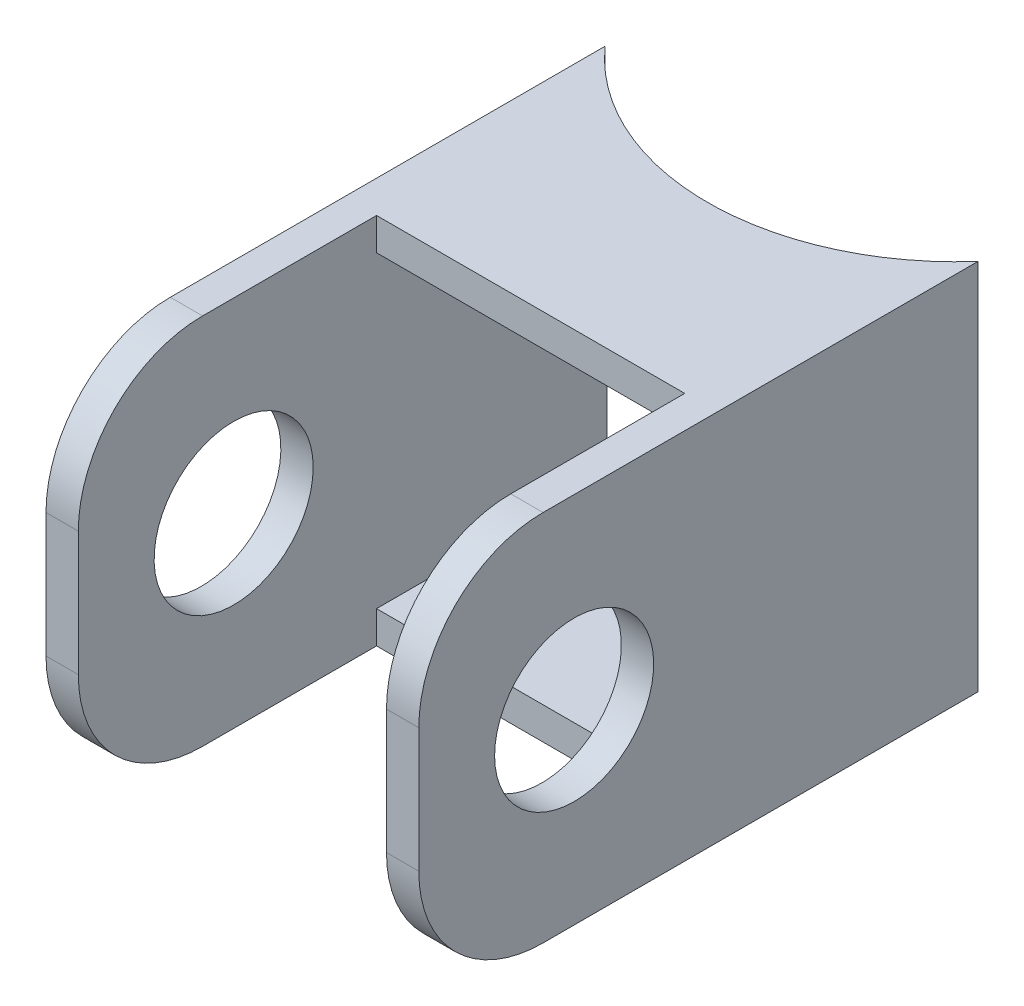
ISO-10303-21;
HEADER;
FILE_DESCRIPTION(('STEP AP214'),'2;1');
FILE_NAME('part.step','',(''),(''),'','','');
FILE_SCHEMA(('AUTOMOTIVE_DESIGN { 1 0 10303 214 1 1 1 1 }'));
ENDSEC;
DATA;
#1=APPLICATION_CONTEXT('core data for automotive mechanical design processes');
#2=APPLICATION_PROTOCOL_DEFINITION('international standard','automotive_design',2000,#1);
#3=PRODUCT_CONTEXT('',#1,'mechanical');
#4=PRODUCT('Part','Part','',(#3));
#5=PRODUCT_RELATED_PRODUCT_CATEGORY('part','',(#4));
#6=PRODUCT_DEFINITION_FORMATION('','',#4);
#7=PRODUCT_DEFINITION_CONTEXT('part definition',#1,'design');
#8=PRODUCT_DEFINITION('design','',#6,#7);
#9=PRODUCT_DEFINITION_SHAPE('','',#8);
#10=(LENGTH_UNIT() NAMED_UNIT(*) SI_UNIT(.MILLI.,.METRE.));
#11=(NAMED_UNIT(*) PLANE_ANGLE_UNIT() SI_UNIT($,.RADIAN.));
#12=(NAMED_UNIT(*) SI_UNIT($,.STERADIAN.) SOLID_ANGLE_UNIT());
#13=UNCERTAINTY_MEASURE_WITH_UNIT(LENGTH_MEASURE(1.E-05),#10,'distance_accuracy_value','');
#14=(GEOMETRIC_REPRESENTATION_CONTEXT(3) GLOBAL_UNCERTAINTY_ASSIGNED_CONTEXT((#13)) GLOBAL_UNIT_ASSIGNED_CONTEXT((#10,
#11,#12)) REPRESENTATION_CONTEXT('',''));
#15=CARTESIAN_POINT('',(0.,0.,0.));
#16=DIRECTION('',(0.,0.,1.));
#17=DIRECTION('',(1.,0.,0.));
#18=AXIS2_PLACEMENT_3D('',#15,#16,#17);
#19=CARTESIAN_POINT('',(0.,0.,28.575));
#20=DIRECTION('',(0.,0.,1.));
#21=DIRECTION('',(1.,0.,0.));
#22=AXIS2_PLACEMENT_3D('',#19,#20,#21);
#23=PLANE('',#22);
#24=DIRECTION('',(0.,-1.,0.));
#25=VECTOR('',#24,1.);
#26=CARTESIAN_POINT('',(-7.874,7.874,28.575));
#27=LINE('',#26,#25);
#28=CARTESIAN_POINT('',(-7.874,3.175,28.575));
#29=VERTEX_POINT('',#28);
#30=CARTESIAN_POINT('',(-7.874,-3.175,28.575));
#31=VERTEX_POINT('',#30);
#32=EDGE_CURVE('E220',#29,#31,#27,.T.);
#33=ORIENTED_EDGE('',*,*,#32,.F.);
#34=DIRECTION('',(-1.,0.,0.));
#35=VECTOR('',#34,1.);
#36=CARTESIAN_POINT('',(-9.525,3.175,28.575));
#37=LINE('',#36,#35);
#38=CARTESIAN_POINT('',(-9.525,3.175,28.575));
#39=VERTEX_POINT('',#38);
#40=EDGE_CURVE('E260',#29,#39,#37,.T.);
#41=ORIENTED_EDGE('',*,*,#40,.T.);
#42=DIRECTION('',(0.,-1.,0.));
#43=VECTOR('',#42,1.);
#44=CARTESIAN_POINT('',(-9.525,9.525,28.575));
#45=LINE('',#44,#43);
#46=CARTESIAN_POINT('',(-9.525,-3.175,28.575));
#47=VERTEX_POINT('',#46);
#48=EDGE_CURVE('E234',#39,#47,#45,.T.);
#49=ORIENTED_EDGE('',*,*,#48,.T.);
#50=DIRECTION('',(1.,0.,0.));
#51=VECTOR('',#50,1.);
#52=CARTESIAN_POINT('',(-7.874,-3.175,28.575));
#53=LINE('',#52,#51);
#54=EDGE_CURVE('E257',#47,#31,#53,.T.);
#55=ORIENTED_EDGE('',*,*,#54,.T.);
#56=EDGE_LOOP('',(#33,#41,#49,#55));
#57=FACE_BOUND('',#56,.T.);
#58=ADVANCED_FACE('F39',(#57),#23,.T.);
#59=DIRECTION('',(0.,1.,0.));
#60=VECTOR('',#59,1.);
#61=CARTESIAN_POINT('',(9.525,9.525,28.575));
#62=LINE('',#61,#60);
#63=CARTESIAN_POINT('',(9.525,-3.175,28.575));
#64=VERTEX_POINT('',#63);
#65=CARTESIAN_POINT('',(9.525,3.175,28.575));
#66=VERTEX_POINT('',#65);
#67=EDGE_CURVE('E231',#64,#66,#62,.T.);
#68=ORIENTED_EDGE('',*,*,#67,.T.);
#69=DIRECTION('',(-1.,0.,0.));
#70=VECTOR('',#69,1.);
#71=CARTESIAN_POINT('',(7.874,3.175,28.575));
#72=LINE('',#71,#70);
#73=CARTESIAN_POINT('',(7.874,3.175,28.575));
#74=VERTEX_POINT('',#73);
#75=EDGE_CURVE('E277',#66,#74,#72,.T.);
#76=ORIENTED_EDGE('',*,*,#75,.T.);
#77=DIRECTION('',(0.,1.,0.));
#78=VECTOR('',#77,1.);
#79=CARTESIAN_POINT('',(7.874,7.874,28.575));
#80=LINE('',#79,#78);
#81=CARTESIAN_POINT('',(7.874,-3.175,28.575));
#82=VERTEX_POINT('',#81);
#83=EDGE_CURVE('E217',#82,#74,#80,.T.);
#84=ORIENTED_EDGE('',*,*,#83,.F.);
#85=DIRECTION('',(1.,0.,0.));
#86=VECTOR('',#85,1.);
#87=CARTESIAN_POINT('',(9.525,-3.175,28.575));
#88=LINE('',#87,#86);
#89=EDGE_CURVE('E274',#82,#64,#88,.T.);
#90=ORIENTED_EDGE('',*,*,#89,.T.);
#91=EDGE_LOOP('',(#68,#76,#84,#90));
#92=FACE_BOUND('',#91,.T.);
#93=ADVANCED_FACE('F293',(#92),#23,.T.);
#94=CARTESIAN_POINT('',(9.525,9.525,28.575));
#95=DIRECTION('',(-1.,0.,0.));
#96=DIRECTION('',(0.,-1.,0.));
#97=AXIS2_PLACEMENT_3D('',#94,#95,#96);
#98=PLANE('',#97);
#99=CARTESIAN_POINT('',(9.525,0.,20.6375));
#100=DIRECTION('',(-1.,0.,0.));
#101=DIRECTION('',(0.,-1.,0.));
#102=AXIS2_PLACEMENT_3D('',#99,#100,#101);
#103=CIRCLE('',#102,4.064);
#104=CARTESIAN_POINT('',(9.525,-4.064,20.6375));
#105=VERTEX_POINT('',#104);
#106=EDGE_CURVE('E199',#105,#105,#103,.T.);
#107=ORIENTED_EDGE('',*,*,#106,.T.);
#108=EDGE_LOOP('',(#107));
#109=FACE_BOUND('',#108,.T.);
#110=DIRECTION('',(0.,0.,-1.));
#111=VECTOR('',#110,1.);
#112=CARTESIAN_POINT('',(9.525,9.525,28.575));
#113=LINE('',#112,#111);
#114=CARTESIAN_POINT('',(9.525,9.525,22.225));
#115=VERTEX_POINT('',#114);
#116=CARTESIAN_POINT('',(9.525,9.525,0.));
#117=VERTEX_POINT('',#116);
#118=EDGE_CURVE('E248',#115,#117,#113,.T.);
#119=ORIENTED_EDGE('',*,*,#118,.F.);
#120=CARTESIAN_POINT('',(9.525,3.175,22.225));
#121=DIRECTION('',(-1.,0.,0.));
#122=DIRECTION('',(0.,-1.,0.));
#123=AXIS2_PLACEMENT_3D('',#120,#121,#122);
#124=CIRCLE('',#123,6.35);
#125=EDGE_CURVE('E285',#115,#66,#124,.F.);
#126=ORIENTED_EDGE('',*,*,#125,.T.);
#127=ORIENTED_EDGE('',*,*,#67,.F.);
#128=CARTESIAN_POINT('',(9.525,-3.175,22.225));
#129=DIRECTION('',(-1.,0.,0.));
#130=DIRECTION('',(0.,-1.,0.));
#131=AXIS2_PLACEMENT_3D('',#128,#129,#130);
#132=CIRCLE('',#131,6.35);
#133=CARTESIAN_POINT('',(9.525,-9.525,22.225));
#134=VERTEX_POINT('',#133);
#135=EDGE_CURVE('E54',#64,#134,#132,.F.);
#136=ORIENTED_EDGE('',*,*,#135,.T.);
#137=DIRECTION('',(0.,0.,-1.));
#138=VECTOR('',#137,1.);
#139=CARTESIAN_POINT('',(9.525,-9.525,28.575));
#140=LINE('',#139,#138);
#141=CARTESIAN_POINT('',(9.525,-9.525,0.));
#142=VERTEX_POINT('',#141);
#143=EDGE_CURVE('E238',#134,#142,#140,.T.);
#144=ORIENTED_EDGE('',*,*,#143,.T.);
#145=DIRECTION('',(0.,1.,0.));
#146=VECTOR('',#145,1.);
#147=CARTESIAN_POINT('',(9.525,9.525,0.));
#148=LINE('',#147,#146);
#149=EDGE_CURVE('E230',#142,#117,#148,.T.);
#150=ORIENTED_EDGE('',*,*,#149,.T.);
#151=EDGE_LOOP('',(#119,#126,#127,#136,#144,#150));
#152=FACE_BOUND('',#151,.T.);
#153=ADVANCED_FACE('F288',(#109,#152),#98,.F.);
#154=CARTESIAN_POINT('',(-9.525,9.525,28.575));
#155=DIRECTION('',(0.,-1.,0.));
#156=DIRECTION('',(0.,0.,-1.));
#157=AXIS2_PLACEMENT_3D('',#154,#155,#156);
#158=PLANE('',#157);
#159=DIRECTION('',(0.,0.,-1.));
#160=VECTOR('',#159,1.);
#161=CARTESIAN_POINT('',(-9.525,9.525,28.575));
#162=LINE('',#161,#160);
#163=CARTESIAN_POINT('',(-9.525,9.525,22.225));
#164=VERTEX_POINT('',#163);
#165=CARTESIAN_POINT('',(-9.525,9.525,0.));
#166=VERTEX_POINT('',#165);
#167=EDGE_CURVE('E246',#164,#166,#162,.T.);
#168=ORIENTED_EDGE('',*,*,#167,.F.);
#169=DIRECTION('',(-1.,0.,0.));
#170=VECTOR('',#169,1.);
#171=CARTESIAN_POINT('',(-7.874,9.525,22.225));
#172=LINE('',#171,#170);
#173=CARTESIAN_POINT('',(-7.874,9.525,22.225));
#174=VERTEX_POINT('',#173);
#175=EDGE_CURVE('E158',#164,#174,#172,.F.);
#176=ORIENTED_EDGE('',*,*,#175,.T.);
#177=DIRECTION('',(0.,0.,-1.));
#178=VECTOR('',#177,1.);
#179=CARTESIAN_POINT('',(-7.874,9.525,28.575));
#180=LINE('',#179,#178);
#181=CARTESIAN_POINT('',(-7.874,9.525,13.335));
#182=VERTEX_POINT('',#181);
#183=EDGE_CURVE('E150',#174,#182,#180,.T.);
#184=ORIENTED_EDGE('',*,*,#183,.T.);
#185=DIRECTION('',(1.,0.,0.));
#186=VECTOR('',#185,1.);
#187=CARTESIAN_POINT('',(-7.874,9.525,13.335));
#188=LINE('',#187,#186);
#189=CARTESIAN_POINT('',(7.874,9.525,13.335));
#190=VERTEX_POINT('',#189);
#191=EDGE_CURVE('E156',#182,#190,#188,.T.);
#192=ORIENTED_EDGE('',*,*,#191,.T.);
#193=DIRECTION('',(0.,0.,1.));
#194=VECTOR('',#193,1.);
#195=CARTESIAN_POINT('',(7.874,9.525,28.575));
#196=LINE('',#195,#194);
#197=CARTESIAN_POINT('',(7.874,9.525,22.225));
#198=VERTEX_POINT('',#197);
#199=EDGE_CURVE('E177',#190,#198,#196,.T.);
#200=ORIENTED_EDGE('',*,*,#199,.T.);
#201=DIRECTION('',(-1.,0.,0.));
#202=VECTOR('',#201,1.);
#203=CARTESIAN_POINT('',(9.525,9.525,22.225));
#204=LINE('',#203,#202);
#205=EDGE_CURVE('E267',#198,#115,#204,.F.);
#206=ORIENTED_EDGE('',*,*,#205,.T.);
#207=ORIENTED_EDGE('',*,*,#118,.T.);
#208=CARTESIAN_POINT('',(0.,9.525,-8.40026041263007));
#209=DIRECTION('',(0.,-1.,0.));
#210=DIRECTION('',(0.,0.,-1.));
#211=AXIS2_PLACEMENT_3D('',#208,#209,#210);
#212=CIRCLE('',#211,12.7);
#213=EDGE_CURVE('E214',#117,#166,#212,.T.);
#214=ORIENTED_EDGE('',*,*,#213,.T.);
#215=EDGE_LOOP('',(#168,#176,#184,#192,#200,#206,#207,#214));
#216=FACE_BOUND('',#215,.T.);
#217=ADVANCED_FACE('F153',(#216),#158,.F.);
#218=CARTESIAN_POINT('',(-9.525,9.525,28.575));
#219=DIRECTION('',(1.,0.,0.));
#220=DIRECTION('',(0.,1.,0.));
#221=AXIS2_PLACEMENT_3D('',#218,#219,#220);
#222=PLANE('',#221);
#223=CARTESIAN_POINT('',(-9.52500000000001,0.,20.6375));
#224=DIRECTION('',(1.,0.,0.));
#225=DIRECTION('',(0.,1.,0.));
#226=AXIS2_PLACEMENT_3D('',#223,#224,#225);
#227=CIRCLE('',#226,4.064);
#228=CARTESIAN_POINT('',(-9.52500000000001,4.064,20.6375));
#229=VERTEX_POINT('',#228);
#230=EDGE_CURVE('E192',#229,#229,#227,.T.);
#231=ORIENTED_EDGE('',*,*,#230,.T.);
#232=EDGE_LOOP('',(#231));
#233=FACE_BOUND('',#232,.T.);
#234=ORIENTED_EDGE('',*,*,#48,.F.);
#235=CARTESIAN_POINT('',(-9.525,3.175,22.225));
#236=DIRECTION('',(1.,0.,0.));
#237=DIRECTION('',(0.,1.,0.));
#238=AXIS2_PLACEMENT_3D('',#235,#236,#237);
#239=CIRCLE('',#238,6.35);
#240=EDGE_CURVE('E265',#39,#164,#239,.F.);
#241=ORIENTED_EDGE('',*,*,#240,.T.);
#242=ORIENTED_EDGE('',*,*,#167,.T.);
#243=DIRECTION('',(0.,-1.,0.));
#244=VECTOR('',#243,1.);
#245=CARTESIAN_POINT('',(-9.525,9.525,0.));
#246=LINE('',#245,#244);
#247=CARTESIAN_POINT('',(-9.525,-9.525,0.));
#248=VERTEX_POINT('',#247);
#249=EDGE_CURVE('E235',#166,#248,#246,.T.);
#250=ORIENTED_EDGE('',*,*,#249,.T.);
#251=DIRECTION('',(0.,0.,-1.));
#252=VECTOR('',#251,1.);
#253=CARTESIAN_POINT('',(-9.525,-9.525,28.575));
#254=LINE('',#253,#252);
#255=CARTESIAN_POINT('',(-9.525,-9.525,22.225));
#256=VERTEX_POINT('',#255);
#257=EDGE_CURVE('E244',#256,#248,#254,.T.);
#258=ORIENTED_EDGE('',*,*,#257,.F.);
#259=CARTESIAN_POINT('',(-9.525,-3.175,22.225));
#260=DIRECTION('',(1.,0.,0.));
#261=DIRECTION('',(0.,1.,0.));
#262=AXIS2_PLACEMENT_3D('',#259,#260,#261);
#263=CIRCLE('',#262,6.35);
#264=EDGE_CURVE('E263',#256,#47,#263,.F.);
#265=ORIENTED_EDGE('',*,*,#264,.T.);
#266=EDGE_LOOP('',(#234,#241,#242,#250,#258,#265));
#267=FACE_BOUND('',#266,.T.);
#268=ADVANCED_FACE('F348',(#233,#267),#222,.F.);
#269=CARTESIAN_POINT('',(-9.525,-9.525,28.575));
#270=DIRECTION('',(0.,1.,0.));
#271=DIRECTION('',(0.,0.,1.));
#272=AXIS2_PLACEMENT_3D('',#269,#270,#271);
#273=PLANE('',#272);
#274=DIRECTION('',(0.,0.,1.));
#275=VECTOR('',#274,1.);
#276=CARTESIAN_POINT('',(-7.874,-9.525,28.575));
#277=LINE('',#276,#275);
#278=CARTESIAN_POINT('',(-7.874,-9.525,13.335));
#279=VERTEX_POINT('',#278);
#280=CARTESIAN_POINT('',(-7.874,-9.525,22.225));
#281=VERTEX_POINT('',#280);
#282=EDGE_CURVE('E184',#279,#281,#277,.T.);
#283=ORIENTED_EDGE('',*,*,#282,.T.);
#284=DIRECTION('',(1.,0.,0.));
#285=VECTOR('',#284,1.);
#286=CARTESIAN_POINT('',(-9.525,-9.525,22.225));
#287=LINE('',#286,#285);
#288=EDGE_CURVE('E11',#281,#256,#287,.F.);
#289=ORIENTED_EDGE('',*,*,#288,.T.);
#290=ORIENTED_EDGE('',*,*,#257,.T.);
#291=CARTESIAN_POINT('',(0.,-9.525,-8.40026041263007));
#292=DIRECTION('',(0.,1.,0.));
#293=DIRECTION('',(0.,0.,1.));
#294=AXIS2_PLACEMENT_3D('',#291,#292,#293);
#295=CIRCLE('',#294,12.7);
#296=EDGE_CURVE('E202',#248,#142,#295,.T.);
#297=ORIENTED_EDGE('',*,*,#296,.T.);
#298=ORIENTED_EDGE('',*,*,#143,.F.);
#299=DIRECTION('',(1.,0.,0.));
#300=VECTOR('',#299,1.);
#301=CARTESIAN_POINT('',(7.874,-9.525,22.225));
#302=LINE('',#301,#300);
#303=CARTESIAN_POINT('',(7.874,-9.525,22.225));
#304=VERTEX_POINT('',#303);
#305=EDGE_CURVE('E47',#134,#304,#302,.F.);
#306=ORIENTED_EDGE('',*,*,#305,.T.);
#307=DIRECTION('',(0.,0.,-1.));
#308=VECTOR('',#307,1.);
#309=CARTESIAN_POINT('',(7.874,-9.525,28.575));
#310=LINE('',#309,#308);
#311=CARTESIAN_POINT('',(7.874,-9.525,13.335));
#312=VERTEX_POINT('',#311);
#313=EDGE_CURVE('E181',#304,#312,#310,.T.);
#314=ORIENTED_EDGE('',*,*,#313,.T.);
#315=DIRECTION('',(-1.,0.,0.));
#316=VECTOR('',#315,1.);
#317=CARTESIAN_POINT('',(-9.525,-9.525,13.335));
#318=LINE('',#317,#316);
#319=EDGE_CURVE('E189',#312,#279,#318,.T.);
#320=ORIENTED_EDGE('',*,*,#319,.T.);
#321=EDGE_LOOP('',(#283,#289,#290,#297,#298,#306,#314,#320));
#322=FACE_BOUND('',#321,.T.);
#323=ADVANCED_FACE('F306',(#322),#273,.F.);
#324=CARTESIAN_POINT('',(7.874,7.874,28.575));
#325=DIRECTION('',(-1.,0.,0.));
#326=DIRECTION('',(0.,0.,1.));
#327=AXIS2_PLACEMENT_3D('',#324,#325,#326);
#328=PLANE('',#327);
#329=ORIENTED_EDGE('',*,*,#83,.T.);
#330=CARTESIAN_POINT('',(7.874,3.175,22.225));
#331=DIRECTION('',(-1.,0.,0.));
#332=DIRECTION('',(0.,0.,1.));
#333=AXIS2_PLACEMENT_3D('',#330,#331,#332);
#334=CIRCLE('',#333,6.35);
#335=EDGE_CURVE('E282',#74,#198,#334,.T.);
#336=ORIENTED_EDGE('',*,*,#335,.T.);
#337=ORIENTED_EDGE('',*,*,#199,.F.);
#338=DIRECTION('',(0.,-1.,0.));
#339=VECTOR('',#338,1.);
#340=CARTESIAN_POINT('',(7.874,9.525,13.335));
#341=LINE('',#340,#339);
#342=CARTESIAN_POINT('',(7.874,7.874,13.335));
#343=VERTEX_POINT('',#342);
#344=EDGE_CURVE('E175',#190,#343,#341,.T.);
#345=ORIENTED_EDGE('',*,*,#344,.T.);
#346=DIRECTION('',(0.,0.,-1.));
#347=VECTOR('',#346,1.);
#348=CARTESIAN_POINT('',(7.874,7.874,28.575));
#349=LINE('',#348,#347);
#350=CARTESIAN_POINT('',(7.874,7.874,1.5641825723039));
#351=VERTEX_POINT('',#350);
#352=EDGE_CURVE('E228',#343,#351,#349,.T.);
#353=ORIENTED_EDGE('',*,*,#352,.T.);
#354=DIRECTION('',(0.,1.,0.));
#355=VECTOR('',#354,1.);
#356=CARTESIAN_POINT('',(7.874,-9.525,1.5641825723039));
#357=LINE('',#356,#355);
#358=CARTESIAN_POINT('',(7.874,-7.874,1.5641825723039));
#359=VERTEX_POINT('',#358);
#360=EDGE_CURVE('E211',#359,#351,#357,.T.);
#361=ORIENTED_EDGE('',*,*,#360,.F.);
#362=DIRECTION('',(0.,0.,-1.));
#363=VECTOR('',#362,1.);
#364=CARTESIAN_POINT('',(7.874,-7.874,28.575));
#365=LINE('',#364,#363);
#366=CARTESIAN_POINT('',(7.874,-7.874,13.335));
#367=VERTEX_POINT('',#366);
#368=EDGE_CURVE('E223',#367,#359,#365,.T.);
#369=ORIENTED_EDGE('',*,*,#368,.F.);
#370=EDGE_CURVE('E170',#367,#312,#341,.T.);
#371=ORIENTED_EDGE('',*,*,#370,.T.);
#372=ORIENTED_EDGE('',*,*,#313,.F.);
#373=CARTESIAN_POINT('',(7.874,-3.175,22.225));
#374=DIRECTION('',(-1.,0.,0.));
#375=DIRECTION('',(0.,0.,1.));
#376=AXIS2_PLACEMENT_3D('',#373,#374,#375);
#377=CIRCLE('',#376,6.35);
#378=EDGE_CURVE('E280',#304,#82,#377,.T.);
#379=ORIENTED_EDGE('',*,*,#378,.T.);
#380=EDGE_LOOP('',(#329,#336,#337,#345,#353,#361,#369,#371,#372,#379));
#381=FACE_BOUND('',#380,.T.);
#382=CARTESIAN_POINT('',(7.874,0.,20.6375));
#383=DIRECTION('',(-1.,0.,0.));
#384=DIRECTION('',(0.,0.,1.));
#385=AXIS2_PLACEMENT_3D('',#382,#383,#384);
#386=CIRCLE('',#385,4.064);
#387=CARTESIAN_POINT('',(7.874,0.,24.7015));
#388=VERTEX_POINT('',#387);
#389=EDGE_CURVE('E196',#388,#388,#386,.T.);
#390=ORIENTED_EDGE('',*,*,#389,.F.);
#391=EDGE_LOOP('',(#390));
#392=FACE_BOUND('',#391,.T.);
#393=ADVANCED_FACE('F298',(#381,#392),#328,.T.);
#394=CARTESIAN_POINT('',(-7.874,7.874,28.575));
#395=DIRECTION('',(0.,-1.,0.));
#396=DIRECTION('',(0.,0.,-1.));
#397=AXIS2_PLACEMENT_3D('',#394,#395,#396);
#398=PLANE('',#397);
#399=DIRECTION('',(1.,0.,0.));
#400=VECTOR('',#399,1.);
#401=CARTESIAN_POINT('',(-7.874,7.874,13.335));
#402=LINE('',#401,#400);
#403=CARTESIAN_POINT('',(-7.874,7.874,13.335));
#404=VERTEX_POINT('',#403);
#405=EDGE_CURVE('E187',#404,#343,#402,.T.);
#406=ORIENTED_EDGE('',*,*,#405,.F.);
#407=DIRECTION('',(0.,0.,-1.));
#408=VECTOR('',#407,1.);
#409=CARTESIAN_POINT('',(-7.874,7.874,28.575));
#410=LINE('',#409,#408);
#411=CARTESIAN_POINT('',(-7.874,7.874,1.5641825723039));
#412=VERTEX_POINT('',#411);
#413=EDGE_CURVE('E167',#404,#412,#410,.T.);
#414=ORIENTED_EDGE('',*,*,#413,.T.);
#415=CARTESIAN_POINT('',(0.,7.874,-8.40026041263007));
#416=DIRECTION('',(0.,-1.,0.));
#417=DIRECTION('',(0.,0.,-1.));
#418=AXIS2_PLACEMENT_3D('',#415,#416,#417);
#419=CIRCLE('',#418,12.7);
#420=EDGE_CURVE('E208',#351,#412,#419,.T.);
#421=ORIENTED_EDGE('',*,*,#420,.F.);
#422=ORIENTED_EDGE('',*,*,#352,.F.);
#423=EDGE_LOOP('',(#406,#414,#421,#422));
#424=FACE_BOUND('',#423,.T.);
#425=ADVANCED_FACE('F326',(#424),#398,.T.);
#426=CARTESIAN_POINT('',(-7.874,7.874,28.575));
#427=DIRECTION('',(1.,0.,0.));
#428=DIRECTION('',(0.,0.,-1.));
#429=AXIS2_PLACEMENT_3D('',#426,#427,#428);
#430=PLANE('',#429);
#431=ORIENTED_EDGE('',*,*,#183,.F.);
#432=CARTESIAN_POINT('',(-7.874,3.175,22.225));
#433=DIRECTION('',(1.,0.,0.));
#434=DIRECTION('',(0.,0.,-1.));
#435=AXIS2_PLACEMENT_3D('',#432,#433,#434);
#436=CIRCLE('',#435,6.35);
#437=EDGE_CURVE('E272',#174,#29,#436,.T.);
#438=ORIENTED_EDGE('',*,*,#437,.T.);
#439=ORIENTED_EDGE('',*,*,#32,.T.);
#440=CARTESIAN_POINT('',(-7.874,-3.175,22.225));
#441=DIRECTION('',(1.,0.,0.));
#442=DIRECTION('',(0.,0.,-1.));
#443=AXIS2_PLACEMENT_3D('',#440,#441,#442);
#444=CIRCLE('',#443,6.35);
#445=EDGE_CURVE('E270',#31,#281,#444,.T.);
#446=ORIENTED_EDGE('',*,*,#445,.T.);
#447=ORIENTED_EDGE('',*,*,#282,.F.);
#448=DIRECTION('',(0.,-1.,0.));
#449=VECTOR('',#448,1.);
#450=CARTESIAN_POINT('',(-7.874,9.525,13.335));
#451=LINE('',#450,#449);
#452=CARTESIAN_POINT('',(-7.874,-7.874,13.335));
#453=VERTEX_POINT('',#452);
#454=EDGE_CURVE('E171',#453,#279,#451,.T.);
#455=ORIENTED_EDGE('',*,*,#454,.F.);
#456=DIRECTION('',(0.,0.,-1.));
#457=VECTOR('',#456,1.);
#458=CARTESIAN_POINT('',(-7.874,-7.874,28.575));
#459=LINE('',#458,#457);
#460=CARTESIAN_POINT('',(-7.874,-7.874,1.5641825723039));
#461=VERTEX_POINT('',#460);
#462=EDGE_CURVE('E225',#453,#461,#459,.T.);
#463=ORIENTED_EDGE('',*,*,#462,.T.);
#464=DIRECTION('',(0.,1.,0.));
#465=VECTOR('',#464,1.);
#466=CARTESIAN_POINT('',(-7.874,-9.525,1.5641825723039));
#467=LINE('',#466,#465);
#468=EDGE_CURVE('E205',#412,#461,#467,.F.);
#469=ORIENTED_EDGE('',*,*,#468,.F.);
#470=ORIENTED_EDGE('',*,*,#413,.F.);
#471=EDGE_CURVE('E163',#182,#404,#451,.T.);
#472=ORIENTED_EDGE('',*,*,#471,.F.);
#473=EDGE_LOOP('',(#431,#438,#439,#446,#447,#455,#463,#469,#470,#472));
#474=FACE_BOUND('',#473,.T.);
#475=CARTESIAN_POINT('',(-7.874,0.,20.6375));
#476=DIRECTION('',(1.,0.,0.));
#477=DIRECTION('',(0.,0.,-1.));
#478=AXIS2_PLACEMENT_3D('',#475,#476,#477);
#479=CIRCLE('',#478,4.064);
#480=CARTESIAN_POINT('',(-7.874,0.,16.5735));
#481=VERTEX_POINT('',#480);
#482=EDGE_CURVE('E195',#481,#481,#479,.T.);
#483=ORIENTED_EDGE('',*,*,#482,.F.);
#484=EDGE_LOOP('',(#483));
#485=FACE_BOUND('',#484,.T.);
#486=ADVANCED_FACE('F164',(#474,#485),#430,.T.);
#487=CARTESIAN_POINT('',(-7.874,-7.874,28.575));
#488=DIRECTION('',(0.,1.,0.));
#489=DIRECTION('',(0.,0.,1.));
#490=AXIS2_PLACEMENT_3D('',#487,#488,#489);
#491=PLANE('',#490);
#492=DIRECTION('',(-1.,0.,0.));
#493=VECTOR('',#492,1.);
#494=CARTESIAN_POINT('',(-7.874,-7.874,13.335));
#495=LINE('',#494,#493);
#496=EDGE_CURVE('E253',#367,#453,#495,.T.);
#497=ORIENTED_EDGE('',*,*,#496,.F.);
#498=ORIENTED_EDGE('',*,*,#368,.T.);
#499=CARTESIAN_POINT('',(0.,-7.874,-8.40026041263007));
#500=DIRECTION('',(0.,1.,0.));
#501=DIRECTION('',(0.,0.,1.));
#502=AXIS2_PLACEMENT_3D('',#499,#500,#501);
#503=CIRCLE('',#502,12.7);
#504=EDGE_CURVE('E250',#461,#359,#503,.T.);
#505=ORIENTED_EDGE('',*,*,#504,.F.);
#506=ORIENTED_EDGE('',*,*,#462,.F.);
#507=EDGE_LOOP('',(#497,#498,#505,#506));
#508=FACE_BOUND('',#507,.T.);
#509=ADVANCED_FACE('F320',(#508),#491,.T.);
#510=CARTESIAN_POINT('',(0.,-9.525,-8.40026041263007));
#511=DIRECTION('',(0.,1.,0.));
#512=DIRECTION('',(0.,0.,1.));
#513=AXIS2_PLACEMENT_3D('',#510,#511,#512);
#514=CYLINDRICAL_SURFACE('',#513,12.7);
#515=ORIENTED_EDGE('',*,*,#360,.T.);
#516=ORIENTED_EDGE('',*,*,#420,.T.);
#517=ORIENTED_EDGE('',*,*,#468,.T.);
#518=ORIENTED_EDGE('',*,*,#504,.T.);
#519=EDGE_LOOP('',(#515,#516,#517,#518));
#520=FACE_BOUND('',#519,.T.);
#521=ORIENTED_EDGE('',*,*,#296,.F.);
#522=ORIENTED_EDGE('',*,*,#249,.F.);
#523=ORIENTED_EDGE('',*,*,#213,.F.);
#524=ORIENTED_EDGE('',*,*,#149,.F.);
#525=EDGE_LOOP('',(#521,#522,#523,#524));
#526=FACE_BOUND('',#525,.T.);
#527=ADVANCED_FACE('F305',(#520,#526),#514,.F.);
#528=CARTESIAN_POINT('',(-9.52500000000001,0.,20.6375));
#529=DIRECTION('',(1.,0.,0.));
#530=DIRECTION('',(0.,1.,0.));
#531=AXIS2_PLACEMENT_3D('',#528,#529,#530);
#532=CYLINDRICAL_SURFACE('',#531,4.064);
#533=ORIENTED_EDGE('',*,*,#482,.T.);
#534=EDGE_LOOP('',(#533));
#535=FACE_BOUND('',#534,.T.);
#536=ORIENTED_EDGE('',*,*,#230,.F.);
#537=EDGE_LOOP('',(#536));
#538=FACE_BOUND('',#537,.T.);
#539=ADVANCED_FACE('F439',(#535,#538),#532,.F.);
#540=ORIENTED_EDGE('',*,*,#389,.T.);
#541=EDGE_LOOP('',(#540));
#542=FACE_BOUND('',#541,.T.);
#543=ORIENTED_EDGE('',*,*,#106,.F.);
#544=EDGE_LOOP('',(#543));
#545=FACE_BOUND('',#544,.T.);
#546=ADVANCED_FACE('F410',(#542,#545),#532,.F.);
#547=CARTESIAN_POINT('',(-7.874,9.525,13.335));
#548=DIRECTION('',(0.,0.,-1.));
#549=DIRECTION('',(-1.,0.,0.));
#550=AXIS2_PLACEMENT_3D('',#547,#548,#549);
#551=PLANE('',#550);
#552=ORIENTED_EDGE('',*,*,#370,.F.);
#553=ORIENTED_EDGE('',*,*,#496,.T.);
#554=ORIENTED_EDGE('',*,*,#454,.T.);
#555=ORIENTED_EDGE('',*,*,#319,.F.);
#556=EDGE_LOOP('',(#552,#553,#554,#555));
#557=FACE_BOUND('',#556,.T.);
#558=ADVANCED_FACE('F314',(#557),#551,.F.);
#559=ORIENTED_EDGE('',*,*,#405,.T.);
#560=ORIENTED_EDGE('',*,*,#344,.F.);
#561=ORIENTED_EDGE('',*,*,#191,.F.);
#562=ORIENTED_EDGE('',*,*,#471,.T.);
#563=EDGE_LOOP('',(#559,#560,#561,#562));
#564=FACE_BOUND('',#563,.T.);
#565=ADVANCED_FACE('F173',(#564),#551,.F.);
#566=CARTESIAN_POINT('',(0.,3.175,22.225));
#567=DIRECTION('',(1.,0.,0.));
#568=DIRECTION('',(0.,0.,-1.));
#569=AXIS2_PLACEMENT_3D('',#566,#567,#568);
#570=CYLINDRICAL_SURFACE('',#569,6.35);
#571=ORIENTED_EDGE('',*,*,#437,.F.);
#572=ORIENTED_EDGE('',*,*,#175,.F.);
#573=ORIENTED_EDGE('',*,*,#240,.F.);
#574=ORIENTED_EDGE('',*,*,#40,.F.);
#575=EDGE_LOOP('',(#571,#572,#573,#574));
#576=FACE_BOUND('',#575,.T.);
#577=ADVANCED_FACE('F357',(#576),#570,.T.);
#578=CARTESIAN_POINT('',(0.,3.175,22.225));
#579=DIRECTION('',(1.,0.,0.));
#580=DIRECTION('',(0.,0.,-1.));
#581=AXIS2_PLACEMENT_3D('',#578,#579,#580);
#582=CYLINDRICAL_SURFACE('',#581,6.35);
#583=ORIENTED_EDGE('',*,*,#125,.F.);
#584=ORIENTED_EDGE('',*,*,#205,.F.);
#585=ORIENTED_EDGE('',*,*,#335,.F.);
#586=ORIENTED_EDGE('',*,*,#75,.F.);
#587=EDGE_LOOP('',(#583,#584,#585,#586));
#588=FACE_BOUND('',#587,.T.);
#589=ADVANCED_FACE('F296',(#588),#582,.T.);
#590=CARTESIAN_POINT('',(0.,-3.175,22.225));
#591=DIRECTION('',(-1.,0.,0.));
#592=DIRECTION('',(0.,0.,1.));
#593=AXIS2_PLACEMENT_3D('',#590,#591,#592);
#594=CYLINDRICAL_SURFACE('',#593,6.35);
#595=ORIENTED_EDGE('',*,*,#264,.F.);
#596=ORIENTED_EDGE('',*,*,#288,.F.);
#597=ORIENTED_EDGE('',*,*,#445,.F.);
#598=ORIENTED_EDGE('',*,*,#54,.F.);
#599=EDGE_LOOP('',(#595,#596,#597,#598));
#600=FACE_BOUND('',#599,.T.);
#601=ADVANCED_FACE('F362',(#600),#594,.T.);
#602=CARTESIAN_POINT('',(0.,-3.175,22.225));
#603=DIRECTION('',(-1.,0.,0.));
#604=DIRECTION('',(0.,0.,1.));
#605=AXIS2_PLACEMENT_3D('',#602,#603,#604);
#606=CYLINDRICAL_SURFACE('',#605,6.35);
#607=ORIENTED_EDGE('',*,*,#378,.F.);
#608=ORIENTED_EDGE('',*,*,#305,.F.);
#609=ORIENTED_EDGE('',*,*,#135,.F.);
#610=ORIENTED_EDGE('',*,*,#89,.F.);
#611=EDGE_LOOP('',(#607,#608,#609,#610));
#612=FACE_BOUND('',#611,.T.);
#613=ADVANCED_FACE('F41',(#612),#606,.T.);
#614=CLOSED_SHELL('',(#58,#93,#153,#217,#268,#323,#393,#425,#486,#509,#527,#539,#546,#558,#565,
#577,#589,#601,#613));
#615=MANIFOLD_SOLID_BREP('B2',#614);
#616=ADVANCED_BREP_SHAPE_REPRESENTATION('',(#18,#615),#14);
#617=SHAPE_DEFINITION_REPRESENTATION(#9,#616);
ENDSEC;
END-ISO-10303-21;
